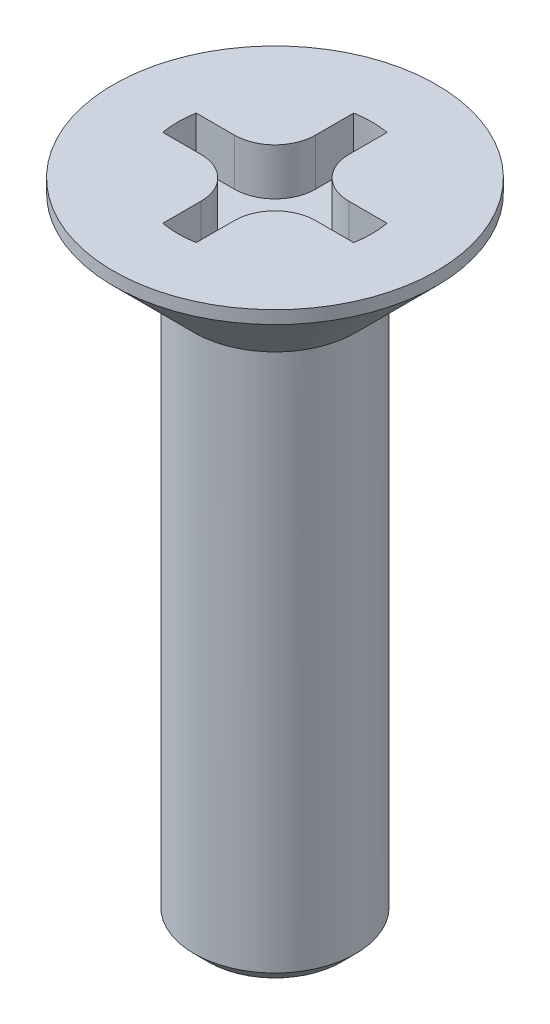
ISO-10303-21;
HEADER;
FILE_DESCRIPTION(('STEP AP214'),'2;1');
FILE_NAME('part.step','',(''),(''),'','','');
FILE_SCHEMA(('AUTOMOTIVE_DESIGN { 1 0 10303 214 1 1 1 1 }'));
ENDSEC;
DATA;
#1=APPLICATION_CONTEXT('core data for automotive mechanical design processes');
#2=APPLICATION_PROTOCOL_DEFINITION('international standard','automotive_design',2000,#1);
#3=PRODUCT_CONTEXT('',#1,'mechanical');
#4=PRODUCT('Part','Part','',(#3));
#5=PRODUCT_RELATED_PRODUCT_CATEGORY('part','',(#4));
#6=PRODUCT_DEFINITION_FORMATION('','',#4);
#7=PRODUCT_DEFINITION_CONTEXT('part definition',#1,'design');
#8=PRODUCT_DEFINITION('design','',#6,#7);
#9=PRODUCT_DEFINITION_SHAPE('','',#8);
#10=(LENGTH_UNIT() NAMED_UNIT(*) SI_UNIT(.MILLI.,.METRE.));
#11=(NAMED_UNIT(*) PLANE_ANGLE_UNIT() SI_UNIT($,.RADIAN.));
#12=(NAMED_UNIT(*) SI_UNIT($,.STERADIAN.) SOLID_ANGLE_UNIT());
#13=UNCERTAINTY_MEASURE_WITH_UNIT(LENGTH_MEASURE(1.E-05),#10,'distance_accuracy_value','');
#14=(GEOMETRIC_REPRESENTATION_CONTEXT(3) GLOBAL_UNCERTAINTY_ASSIGNED_CONTEXT((#13)) GLOBAL_UNIT_ASSIGNED_CONTEXT((#10,
#11,#12)) REPRESENTATION_CONTEXT('',''));
#15=CARTESIAN_POINT('',(0.,0.,0.));
#16=DIRECTION('',(0.,0.,1.));
#17=DIRECTION('',(1.,0.,0.));
#18=AXIS2_PLACEMENT_3D('',#15,#16,#17);
#19=CARTESIAN_POINT('',(0.,-8.55,0.));
#20=DIRECTION('',(0.,1.,0.));
#21=DIRECTION('',(-1.,0.,0.));
#22=AXIS2_PLACEMENT_3D('',#19,#20,#21);
#23=CYLINDRICAL_SURFACE('',#22,1.025);
#24=CARTESIAN_POINT('',(0.,0.,0.));
#25=DIRECTION('',(0.,1.,0.));
#26=DIRECTION('',(0.,0.,1.));
#27=AXIS2_PLACEMENT_3D('',#24,#25,#26);
#28=CIRCLE('',#27,1.025);
#29=CARTESIAN_POINT('',(0.,0.,1.025));
#30=VERTEX_POINT('',#29);
#31=EDGE_CURVE('P0_E21',#30,#30,#28,.F.);
#32=ORIENTED_EDGE('',*,*,#31,.T.);
#33=EDGE_LOOP('',(#32));
#34=FACE_BOUND('',#33,.T.);
#35=CARTESIAN_POINT('',(0.,-8.55,0.));
#36=DIRECTION('',(0.,1.,0.));
#37=DIRECTION('',(0.,0.,1.));
#38=AXIS2_PLACEMENT_3D('',#35,#36,#37);
#39=CIRCLE('',#38,1.025);
#40=CARTESIAN_POINT('',(0.,-8.55,1.025));
#41=VERTEX_POINT('',#40);
#42=EDGE_CURVE('P0_E11',#41,#41,#39,.T.);
#43=ORIENTED_EDGE('',*,*,#42,.T.);
#44=EDGE_LOOP('',(#43));
#45=FACE_BOUND('',#44,.T.);
#46=ADVANCED_FACE('P0_F17',(#34,#45),#23,.T.);
#47=CARTESIAN_POINT('',(0.,0.,0.));
#48=DIRECTION('',(0.,1.,0.));
#49=DIRECTION('',(1.,0.,0.));
#50=AXIS2_PLACEMENT_3D('',#47,#48,#49);
#51=PLANE('',#50);
#52=CARTESIAN_POINT('',(-1.25,0.,0.));
#53=CARTESIAN_POINT('',(-1.25,0.,0.248354274519565));
#54=CARTESIAN_POINT('',(-1.15484941563911,0.,0.478354290456362));
#55=CARTESIAN_POINT('',(-1.06001017605389,0.,0.707601717180522));
#56=CARTESIAN_POINT('',(-0.883883476483185,0.,0.883883476483185));
#57=CARTESIAN_POINT('',(-0.708534252031886,0.,1.05938707618712));
#58=CARTESIAN_POINT('',(-0.478354290456362,0.,1.15484941563911));
#59=CARTESIAN_POINT('',(-0.24919041101688,0.,1.24989035621207));
#60=CARTESIAN_POINT('',(0.,0.,1.25));
#61=CARTESIAN_POINT('',(0.248090411158747,0.,1.25010915978796));
#62=CARTESIAN_POINT('',(0.478354290456362,0.,1.15484941563911));
#63=CARTESIAN_POINT('',(0.707601717180586,0.,1.06001017605387));
#64=CARTESIAN_POINT('',(0.883883476483184,0.,0.883883476483185));
#65=CARTESIAN_POINT('',(1.05938707618716,0.,0.708534252031802));
#66=CARTESIAN_POINT('',(1.15484941563911,0.,0.478354290456362));
#67=CARTESIAN_POINT('',(1.25,0.,0.248926036573121));
#68=CARTESIAN_POINT('',(1.25,0.,0.));
#69=B_SPLINE_CURVE_WITH_KNOTS('',2,(#52,#53,#54,#55,#56,#57,#58,#59,#60,#61,#62,#63,#64,#65,#66,
#67,#68),.UNSPECIFIED.,.F.,.F.,(3,2,2,2,2,2,2,2,3),(0.,0.125,0.25,0.375,0.5,0.625,0.75,0.875,
1.),.UNSPECIFIED.);
#70=CARTESIAN_POINT('',(-1.25,0.,0.));
#71=VERTEX_POINT('',#70);
#72=CARTESIAN_POINT('',(1.25,0.,0.));
#73=VERTEX_POINT('',#72);
#74=EDGE_CURVE('P0_E35',#71,#73,#69,.T.);
#75=ORIENTED_EDGE('',*,*,#74,.F.);
#76=CARTESIAN_POINT('',(1.25,0.,0.));
#77=CARTESIAN_POINT('',(1.25,0.,-0.248354274519565));
#78=CARTESIAN_POINT('',(1.15484941563911,0.,-0.478354290456362));
#79=CARTESIAN_POINT('',(1.06001017605389,0.,-0.707601717180522));
#80=CARTESIAN_POINT('',(0.883883476483185,0.,-0.883883476483185));
#81=CARTESIAN_POINT('',(0.708534252031886,0.,-1.05938707618712));
#82=CARTESIAN_POINT('',(0.478354290456362,0.,-1.15484941563911));
#83=CARTESIAN_POINT('',(0.24919041101688,0.,-1.24989035621207));
#84=CARTESIAN_POINT('',(0.,0.,-1.25));
#85=CARTESIAN_POINT('',(-0.248090411158747,0.,-1.25010915978796));
#86=CARTESIAN_POINT('',(-0.478354290456362,0.,-1.15484941563911));
#87=CARTESIAN_POINT('',(-0.707601717180586,0.,-1.06001017605387));
#88=CARTESIAN_POINT('',(-0.883883476483184,0.,-0.883883476483185));
#89=CARTESIAN_POINT('',(-1.05938707618716,0.,-0.708534252031802));
#90=CARTESIAN_POINT('',(-1.15484941563911,0.,-0.478354290456362));
#91=CARTESIAN_POINT('',(-1.25,0.,-0.248926036573121));
#92=CARTESIAN_POINT('',(-1.25,0.,0.));
#93=B_SPLINE_CURVE_WITH_KNOTS('',2,(#76,#77,#78,#79,#80,#81,#82,#83,#84,#85,#86,#87,#88,#89,#90,
#91,#92),.UNSPECIFIED.,.F.,.F.,(3,2,2,2,2,2,2,2,3),(0.,0.125,0.25,0.375,0.5,0.625,0.75,0.875,
1.),.UNSPECIFIED.);
#94=EDGE_CURVE('P0_E33',#73,#71,#93,.T.);
#95=ORIENTED_EDGE('',*,*,#94,.F.);
#96=EDGE_LOOP('',(#75,#95));
#97=FACE_BOUND('',#96,.T.);
#98=ORIENTED_EDGE('',*,*,#31,.F.);
#99=EDGE_LOOP('',(#98));
#100=FACE_BOUND('',#99,.T.);
#101=ADVANCED_FACE('P0_F18',(#97,#100),#51,.F.);
#102=OPEN_SHELL('',(#46,#101));
#103=SHELL_BASED_SURFACE_MODEL('P0_B1',(#102));
#104=CARTESIAN_POINT('',(0.,0.725,0.));
#105=DIRECTION('',(0.,-1.,0.));
#106=DIRECTION('',(0.,0.,-1.));
#107=AXIS2_PLACEMENT_3D('',#104,#105,#106);
#108=PLANE('',#107);
#109=CARTESIAN_POINT('',(-0.8838834764832,0.725,0.8838834764832));
#110=DIRECTION('',(0.,1.,0.));
#111=DIRECTION('',(1.,0.,0.));
#112=AXIS2_PLACEMENT_3D('',#109,#110,#111);
#113=CIRCLE('',#112,0.625);
#114=CARTESIAN_POINT('',(-0.2588834764832,0.725,0.8838834764832));
#115=VERTEX_POINT('',#114);
#116=CARTESIAN_POINT('',(-0.8838834764832,0.725,0.2588834764832));
#117=VERTEX_POINT('',#116);
#118=EDGE_CURVE('P1_E11',#115,#117,#113,.T.);
#119=ORIENTED_EDGE('',*,*,#118,.F.);
#120=DIRECTION('',(0.,0.,-1.));
#121=VECTOR('',#120,1.);
#122=CARTESIAN_POINT('',(-0.2588834764832,0.725,1.477490895269));
#123=LINE('',#122,#121);
#124=CARTESIAN_POINT('',(-0.2588834764832,0.725,1.477490895269));
#125=VERTEX_POINT('',#124);
#126=EDGE_CURVE('P1_E316',#125,#115,#123,.T.);
#127=ORIENTED_EDGE('',*,*,#126,.F.);
#128=CARTESIAN_POINT('',(0.,0.725,0.));
#129=DIRECTION('',(0.,-1.,0.));
#130=DIRECTION('',(0.172588984322101,0.,0.984993930179606));
#131=AXIS2_PLACEMENT_3D('',#128,#129,#130);
#132=CIRCLE('',#131,1.5);
#133=CARTESIAN_POINT('',(0.2588834764832,0.725,1.477490895269));
#134=VERTEX_POINT('',#133);
#135=EDGE_CURVE('P1_E272',#134,#125,#132,.T.);
#136=ORIENTED_EDGE('',*,*,#135,.F.);
#137=DIRECTION('',(0.,0.,1.));
#138=VECTOR('',#137,1.);
#139=CARTESIAN_POINT('',(0.2588834764832,0.725,0.8838834764832));
#140=LINE('',#139,#138);
#141=CARTESIAN_POINT('',(0.2588834764832,0.725,0.8838834764832));
#142=VERTEX_POINT('',#141);
#143=EDGE_CURVE('P1_E74',#142,#134,#140,.T.);
#144=ORIENTED_EDGE('',*,*,#143,.F.);
#145=CARTESIAN_POINT('',(0.8838834764832,0.725,0.8838834764832));
#146=DIRECTION('',(0.,1.,0.));
#147=DIRECTION('',(0.,0.,-1.));
#148=AXIS2_PLACEMENT_3D('',#145,#146,#147);
#149=CIRCLE('',#148,0.625);
#150=CARTESIAN_POINT('',(0.8838834764832,0.725,0.2588834764832));
#151=VERTEX_POINT('',#150);
#152=EDGE_CURVE('P1_E83',#151,#142,#149,.T.);
#153=ORIENTED_EDGE('',*,*,#152,.F.);
#154=DIRECTION('',(-1.,0.,0.));
#155=VECTOR('',#154,1.);
#156=CARTESIAN_POINT('',(1.477490895269,0.725,0.2588834764832));
#157=LINE('',#156,#155);
#158=CARTESIAN_POINT('',(1.477490895269,0.725,0.2588834764832));
#159=VERTEX_POINT('',#158);
#160=EDGE_CURVE('P1_E202',#159,#151,#157,.T.);
#161=ORIENTED_EDGE('',*,*,#160,.F.);
#162=CARTESIAN_POINT('',(0.,0.725,0.));
#163=DIRECTION('',(0.,-1.,0.));
#164=DIRECTION('',(0.984993930179606,0.,-0.172588984322101));
#165=AXIS2_PLACEMENT_3D('',#162,#163,#164);
#166=CIRCLE('',#165,1.5);
#167=CARTESIAN_POINT('',(1.477490895269,0.725,-0.2588834764832));
#168=VERTEX_POINT('',#167);
#169=EDGE_CURVE('P1_E302',#168,#159,#166,.T.);
#170=ORIENTED_EDGE('',*,*,#169,.F.);
#171=DIRECTION('',(1.,0.,0.));
#172=VECTOR('',#171,1.);
#173=CARTESIAN_POINT('',(0.8838834764832,0.725,-0.2588834764832));
#174=LINE('',#173,#172);
#175=CARTESIAN_POINT('',(0.8838834764832,0.725,-0.2588834764832));
#176=VERTEX_POINT('',#175);
#177=EDGE_CURVE('P1_E292',#176,#168,#174,.T.);
#178=ORIENTED_EDGE('',*,*,#177,.F.);
#179=CARTESIAN_POINT('',(0.8838834764832,0.725,-0.8838834764832));
#180=DIRECTION('',(0.,1.,0.));
#181=DIRECTION('',(-1.,0.,0.));
#182=AXIS2_PLACEMENT_3D('',#179,#180,#181);
#183=CIRCLE('',#182,0.625);
#184=CARTESIAN_POINT('',(0.2588834764832,0.725,-0.8838834764832));
#185=VERTEX_POINT('',#184);
#186=EDGE_CURVE('P1_E290',#185,#176,#183,.T.);
#187=ORIENTED_EDGE('',*,*,#186,.F.);
#188=DIRECTION('',(0.,0.,1.));
#189=VECTOR('',#188,1.);
#190=CARTESIAN_POINT('',(0.2588834764832,0.725,-1.477490895269));
#191=LINE('',#190,#189);
#192=CARTESIAN_POINT('',(0.2588834764832,0.725,-1.477490895269));
#193=VERTEX_POINT('',#192);
#194=EDGE_CURVE('P1_E263',#193,#185,#191,.T.);
#195=ORIENTED_EDGE('',*,*,#194,.F.);
#196=CARTESIAN_POINT('',(0.,0.725,0.));
#197=DIRECTION('',(0.,-1.,0.));
#198=DIRECTION('',(-0.172588984322101,0.,-0.984993930179606));
#199=AXIS2_PLACEMENT_3D('',#196,#197,#198);
#200=CIRCLE('',#199,1.5);
#201=CARTESIAN_POINT('',(-0.2588834764832,0.725,-1.477490895269));
#202=VERTEX_POINT('',#201);
#203=EDGE_CURVE('P1_E252',#202,#193,#200,.T.);
#204=ORIENTED_EDGE('',*,*,#203,.F.);
#205=DIRECTION('',(0.,0.,-1.));
#206=VECTOR('',#205,1.);
#207=CARTESIAN_POINT('',(-0.2588834764832,0.725,-0.8838834764832));
#208=LINE('',#207,#206);
#209=CARTESIAN_POINT('',(-0.2588834764832,0.725,-0.8838834764832));
#210=VERTEX_POINT('',#209);
#211=EDGE_CURVE('P1_E167',#210,#202,#208,.T.);
#212=ORIENTED_EDGE('',*,*,#211,.F.);
#213=CARTESIAN_POINT('',(-0.8838834764832,0.725,-0.8838834764832));
#214=DIRECTION('',(0.,1.,0.));
#215=DIRECTION('',(0.,0.,1.));
#216=AXIS2_PLACEMENT_3D('',#213,#214,#215);
#217=CIRCLE('',#216,0.625);
#218=CARTESIAN_POINT('',(-0.8838834764832,0.725,-0.2588834764832));
#219=VERTEX_POINT('',#218);
#220=EDGE_CURVE('P1_E162',#219,#210,#217,.T.);
#221=ORIENTED_EDGE('',*,*,#220,.F.);
#222=DIRECTION('',(1.,0.,0.));
#223=VECTOR('',#222,1.);
#224=CARTESIAN_POINT('',(-1.477490895269,0.725,-0.2588834764832));
#225=LINE('',#224,#223);
#226=CARTESIAN_POINT('',(-1.477490895269,0.725,-0.2588834764832));
#227=VERTEX_POINT('',#226);
#228=EDGE_CURVE('P1_E157',#227,#219,#225,.T.);
#229=ORIENTED_EDGE('',*,*,#228,.F.);
#230=CARTESIAN_POINT('',(0.,0.725,0.));
#231=DIRECTION('',(0.,-1.,0.));
#232=DIRECTION('',(-0.984993930179606,0.,0.172588984322101));
#233=AXIS2_PLACEMENT_3D('',#230,#231,#232);
#234=CIRCLE('',#233,1.5);
#235=CARTESIAN_POINT('',(-1.477490895269,0.725,0.2588834764832));
#236=VERTEX_POINT('',#235);
#237=EDGE_CURVE('P1_E195',#236,#227,#234,.T.);
#238=ORIENTED_EDGE('',*,*,#237,.F.);
#239=DIRECTION('',(-1.,0.,0.));
#240=VECTOR('',#239,1.);
#241=CARTESIAN_POINT('',(-0.8838834764832,0.725,0.2588834764832));
#242=LINE('',#241,#240);
#243=EDGE_CURVE('P1_E250',#117,#236,#242,.T.);
#244=ORIENTED_EDGE('',*,*,#243,.F.);
#245=EDGE_LOOP('',(#119,#127,#136,#144,#153,#161,#170,#178,#187,#195,#204,#212,#221,#229,#238,#244));
#246=FACE_BOUND('',#245,.T.);
#247=ADVANCED_FACE('P1_F17',(#246),#108,.F.);
#248=CARTESIAN_POINT('',(-0.8838834764832,0.725,0.8838834764832));
#249=DIRECTION('',(0.,-1.,0.));
#250=DIRECTION('',(1.,0.,0.));
#251=AXIS2_PLACEMENT_3D('',#248,#249,#250);
#252=CYLINDRICAL_SURFACE('',#251,0.625);
#253=DIRECTION('',(0.,1.,0.));
#254=VECTOR('',#253,1.);
#255=CARTESIAN_POINT('',(-0.2588834764832,0.725,0.8838834764832));
#256=LINE('',#255,#254);
#257=CARTESIAN_POINT('',(-0.2588834764832,1.45,0.8838834764832));
#258=VERTEX_POINT('',#257);
#259=EDGE_CURVE('P1_E27',#115,#258,#256,.T.);
#260=ORIENTED_EDGE('',*,*,#259,.F.);
#261=ORIENTED_EDGE('',*,*,#118,.T.);
#262=DIRECTION('',(0.,1.,0.));
#263=VECTOR('',#262,1.);
#264=CARTESIAN_POINT('',(-0.8838834764832,0.725,0.2588834764832));
#265=LINE('',#264,#263);
#266=CARTESIAN_POINT('',(-0.8838834764832,1.45,0.2588834764832));
#267=VERTEX_POINT('',#266);
#268=EDGE_CURVE('P1_E243',#117,#267,#265,.T.);
#269=ORIENTED_EDGE('',*,*,#268,.T.);
#270=CARTESIAN_POINT('',(-0.8838834764832,1.45,0.8838834764832));
#271=DIRECTION('',(0.,1.,0.));
#272=DIRECTION('',(1.,0.,0.));
#273=AXIS2_PLACEMENT_3D('',#270,#271,#272);
#274=CIRCLE('',#273,0.625);
#275=EDGE_CURVE('P1_E242',#258,#267,#274,.T.);
#276=ORIENTED_EDGE('',*,*,#275,.F.);
#277=EDGE_LOOP('',(#260,#261,#269,#276));
#278=FACE_BOUND('',#277,.T.);
#279=ADVANCED_FACE('P1_F330',(#278),#252,.T.);
#280=CARTESIAN_POINT('',(-0.2588834764832,0.725,1.477490895269));
#281=DIRECTION('',(-1.,0.,0.));
#282=DIRECTION('',(0.,0.,1.));
#283=AXIS2_PLACEMENT_3D('',#280,#281,#282);
#284=PLANE('',#283);
#285=DIRECTION('',(0.,1.,0.));
#286=VECTOR('',#285,1.);
#287=CARTESIAN_POINT('',(-0.2588834764832,0.725,1.477490895269));
#288=LINE('',#287,#286);
#289=CARTESIAN_POINT('',(-0.2588834764832,1.45,1.477490895269));
#290=VERTEX_POINT('',#289);
#291=EDGE_CURVE('P1_E277',#125,#290,#288,.T.);
#292=ORIENTED_EDGE('',*,*,#291,.F.);
#293=ORIENTED_EDGE('',*,*,#126,.T.);
#294=ORIENTED_EDGE('',*,*,#259,.T.);
#295=DIRECTION('',(0.,0.,-1.));
#296=VECTOR('',#295,1.);
#297=CARTESIAN_POINT('',(-0.2588834764832,1.45,1.477490895269));
#298=LINE('',#297,#296);
#299=EDGE_CURVE('P1_E237',#290,#258,#298,.T.);
#300=ORIENTED_EDGE('',*,*,#299,.F.);
#301=EDGE_LOOP('',(#292,#293,#294,#300));
#302=FACE_BOUND('',#301,.T.);
#303=ADVANCED_FACE('P1_F324',(#302),#284,.F.);
#304=CARTESIAN_POINT('',(0.,0.725,0.));
#305=DIRECTION('',(0.,-1.,0.));
#306=DIRECTION('',(1.,0.,0.));
#307=AXIS2_PLACEMENT_3D('',#304,#305,#306);
#308=CYLINDRICAL_SURFACE('',#307,1.5);
#309=DIRECTION('',(0.,1.,0.));
#310=VECTOR('',#309,1.);
#311=CARTESIAN_POINT('',(0.2588834764832,0.725,1.477490895269));
#312=LINE('',#311,#310);
#313=CARTESIAN_POINT('',(0.2588834764832,1.45,1.477490895269));
#314=VERTEX_POINT('',#313);
#315=EDGE_CURVE('P1_E280',#134,#314,#312,.T.);
#316=ORIENTED_EDGE('',*,*,#315,.F.);
#317=ORIENTED_EDGE('',*,*,#135,.T.);
#318=ORIENTED_EDGE('',*,*,#291,.T.);
#319=CARTESIAN_POINT('',(0.,1.45,0.));
#320=DIRECTION('',(0.,-1.,0.));
#321=DIRECTION('',(0.172588984322101,0.,0.984993930179606));
#322=AXIS2_PLACEMENT_3D('',#319,#320,#321);
#323=CIRCLE('',#322,1.5);
#324=EDGE_CURVE('P1_E234',#314,#290,#323,.T.);
#325=ORIENTED_EDGE('',*,*,#324,.F.);
#326=EDGE_LOOP('',(#316,#317,#318,#325));
#327=FACE_BOUND('',#326,.T.);
#328=ADVANCED_FACE('P1_F339',(#327),#308,.F.);
#329=CARTESIAN_POINT('',(0.2588834764832,0.725,0.8838834764832));
#330=DIRECTION('',(1.,0.,0.));
#331=DIRECTION('',(0.,1.,0.));
#332=AXIS2_PLACEMENT_3D('',#329,#330,#331);
#333=PLANE('',#332);
#334=DIRECTION('',(0.,1.,0.));
#335=VECTOR('',#334,1.);
#336=CARTESIAN_POINT('',(0.2588834764832,0.725,0.8838834764832));
#337=LINE('',#336,#335);
#338=CARTESIAN_POINT('',(0.2588834764832,1.45,0.8838834764832));
#339=VERTEX_POINT('',#338);
#340=EDGE_CURVE('P1_E310',#142,#339,#337,.T.);
#341=ORIENTED_EDGE('',*,*,#340,.F.);
#342=ORIENTED_EDGE('',*,*,#143,.T.);
#343=ORIENTED_EDGE('',*,*,#315,.T.);
#344=DIRECTION('',(0.,0.,1.));
#345=VECTOR('',#344,1.);
#346=CARTESIAN_POINT('',(0.2588834764832,1.45,0.8838834764832));
#347=LINE('',#346,#345);
#348=EDGE_CURVE('P1_E231',#339,#314,#347,.T.);
#349=ORIENTED_EDGE('',*,*,#348,.F.);
#350=EDGE_LOOP('',(#341,#342,#343,#349));
#351=FACE_BOUND('',#350,.T.);
#352=ADVANCED_FACE('P1_F340',(#351),#333,.F.);
#353=CARTESIAN_POINT('',(0.8838834764832,0.725,0.8838834764832));
#354=DIRECTION('',(0.,-1.,0.));
#355=DIRECTION('',(1.,0.,0.));
#356=AXIS2_PLACEMENT_3D('',#353,#354,#355);
#357=CYLINDRICAL_SURFACE('',#356,0.625);
#358=DIRECTION('',(0.,1.,0.));
#359=VECTOR('',#358,1.);
#360=CARTESIAN_POINT('',(0.8838834764832,0.725,0.2588834764832));
#361=LINE('',#360,#359);
#362=CARTESIAN_POINT('',(0.8838834764832,1.45,0.2588834764832));
#363=VERTEX_POINT('',#362);
#364=EDGE_CURVE('P1_E207',#151,#363,#361,.T.);
#365=ORIENTED_EDGE('',*,*,#364,.F.);
#366=ORIENTED_EDGE('',*,*,#152,.T.);
#367=ORIENTED_EDGE('',*,*,#340,.T.);
#368=CARTESIAN_POINT('',(0.8838834764832,1.45,0.8838834764832));
#369=DIRECTION('',(0.,1.,0.));
#370=DIRECTION('',(0.,0.,-1.));
#371=AXIS2_PLACEMENT_3D('',#368,#369,#370);
#372=CIRCLE('',#371,0.625);
#373=EDGE_CURVE('P1_E227',#363,#339,#372,.T.);
#374=ORIENTED_EDGE('',*,*,#373,.F.);
#375=EDGE_LOOP('',(#365,#366,#367,#374));
#376=FACE_BOUND('',#375,.T.);
#377=ADVANCED_FACE('P1_F447',(#376),#357,.T.);
#378=CARTESIAN_POINT('',(1.477490895269,0.725,0.2588834764832));
#379=DIRECTION('',(0.,0.,1.));
#380=DIRECTION('',(1.,0.,0.));
#381=AXIS2_PLACEMENT_3D('',#378,#379,#380);
#382=PLANE('',#381);
#383=DIRECTION('',(0.,1.,0.));
#384=VECTOR('',#383,1.);
#385=CARTESIAN_POINT('',(1.477490895269,0.725,0.2588834764832));
#386=LINE('',#385,#384);
#387=CARTESIAN_POINT('',(1.477490895269,1.45,0.2588834764832));
#388=VERTEX_POINT('',#387);
#389=EDGE_CURVE('P1_E209',#159,#388,#386,.T.);
#390=ORIENTED_EDGE('',*,*,#389,.F.);
#391=ORIENTED_EDGE('',*,*,#160,.T.);
#392=ORIENTED_EDGE('',*,*,#364,.T.);
#393=DIRECTION('',(-1.,0.,0.));
#394=VECTOR('',#393,1.);
#395=CARTESIAN_POINT('',(1.477490895269,1.45,0.2588834764832));
#396=LINE('',#395,#394);
#397=EDGE_CURVE('P1_E226',#388,#363,#396,.T.);
#398=ORIENTED_EDGE('',*,*,#397,.F.);
#399=EDGE_LOOP('',(#390,#391,#392,#398));
#400=FACE_BOUND('',#399,.T.);
#401=ADVANCED_FACE('P1_F395',(#400),#382,.F.);
#402=CARTESIAN_POINT('',(0.,0.725,0.));
#403=DIRECTION('',(0.,-1.,0.));
#404=DIRECTION('',(1.,0.,0.));
#405=AXIS2_PLACEMENT_3D('',#402,#403,#404);
#406=CYLINDRICAL_SURFACE('',#405,1.5);
#407=DIRECTION('',(0.,1.,0.));
#408=VECTOR('',#407,1.);
#409=CARTESIAN_POINT('',(1.477490895269,0.725,-0.2588834764832));
#410=LINE('',#409,#408);
#411=CARTESIAN_POINT('',(1.477490895269,1.45,-0.2588834764832));
#412=VERTEX_POINT('',#411);
#413=EDGE_CURVE('P1_E297',#168,#412,#410,.T.);
#414=ORIENTED_EDGE('',*,*,#413,.F.);
#415=ORIENTED_EDGE('',*,*,#169,.T.);
#416=ORIENTED_EDGE('',*,*,#389,.T.);
#417=CARTESIAN_POINT('',(0.,1.45,0.));
#418=DIRECTION('',(0.,-1.,0.));
#419=DIRECTION('',(0.984993930179606,0.,-0.172588984322101));
#420=AXIS2_PLACEMENT_3D('',#417,#418,#419);
#421=CIRCLE('',#420,1.5);
#422=EDGE_CURVE('P1_E225',#412,#388,#421,.T.);
#423=ORIENTED_EDGE('',*,*,#422,.F.);
#424=EDGE_LOOP('',(#414,#415,#416,#423));
#425=FACE_BOUND('',#424,.T.);
#426=ADVANCED_FACE('P1_F388',(#425),#406,.F.);
#427=CARTESIAN_POINT('',(0.8838834764832,0.725,-0.2588834764832));
#428=DIRECTION('',(0.,0.,-1.));
#429=DIRECTION('',(0.,-1.,0.));
#430=AXIS2_PLACEMENT_3D('',#427,#428,#429);
#431=PLANE('',#430);
#432=ORIENTED_EDGE('',*,*,#177,.T.);
#433=ORIENTED_EDGE('',*,*,#413,.T.);
#434=DIRECTION('',(1.,0.,0.));
#435=VECTOR('',#434,1.);
#436=CARTESIAN_POINT('',(0.8838834764832,1.45,-0.2588834764832));
#437=LINE('',#436,#435);
#438=CARTESIAN_POINT('',(0.8838834764832,1.45,-0.2588834764832));
#439=VERTEX_POINT('',#438);
#440=EDGE_CURVE('P1_E217',#439,#412,#437,.T.);
#441=ORIENTED_EDGE('',*,*,#440,.F.);
#442=DIRECTION('',(0.,1.,0.));
#443=VECTOR('',#442,1.);
#444=CARTESIAN_POINT('',(0.8838834764832,0.725,-0.2588834764832));
#445=LINE('',#444,#443);
#446=EDGE_CURVE('P1_E295',#176,#439,#445,.T.);
#447=ORIENTED_EDGE('',*,*,#446,.F.);
#448=EDGE_LOOP('',(#432,#433,#441,#447));
#449=FACE_BOUND('',#448,.T.);
#450=ADVANCED_FACE('P1_F384',(#449),#431,.F.);
#451=CARTESIAN_POINT('',(0.8838834764832,0.725,-0.8838834764832));
#452=DIRECTION('',(0.,-1.,0.));
#453=DIRECTION('',(1.,0.,0.));
#454=AXIS2_PLACEMENT_3D('',#451,#452,#453);
#455=CYLINDRICAL_SURFACE('',#454,0.625);
#456=ORIENTED_EDGE('',*,*,#186,.T.);
#457=ORIENTED_EDGE('',*,*,#446,.T.);
#458=CARTESIAN_POINT('',(0.8838834764832,1.45,-0.8838834764832));
#459=DIRECTION('',(0.,-1.,0.));
#460=DIRECTION('',(0.,0.,1.));
#461=AXIS2_PLACEMENT_3D('',#458,#459,#460);
#462=CIRCLE('',#461,0.625);
#463=CARTESIAN_POINT('',(0.2588834764832,1.45,-0.8838834764832));
#464=VERTEX_POINT('',#463);
#465=EDGE_CURVE('P1_E212',#439,#464,#462,.T.);
#466=ORIENTED_EDGE('',*,*,#465,.T.);
#467=DIRECTION('',(0.,1.,0.));
#468=VECTOR('',#467,1.);
#469=CARTESIAN_POINT('',(0.2588834764832,0.725,-0.8838834764832));
#470=LINE('',#469,#468);
#471=EDGE_CURVE('P1_E286',#185,#464,#470,.T.);
#472=ORIENTED_EDGE('',*,*,#471,.F.);
#473=EDGE_LOOP('',(#456,#457,#466,#472));
#474=FACE_BOUND('',#473,.T.);
#475=ADVANCED_FACE('P1_F374',(#474),#455,.T.);
#476=CARTESIAN_POINT('',(0.2588834764832,0.725,-1.477490895269));
#477=DIRECTION('',(1.,0.,0.));
#478=DIRECTION('',(0.,1.,0.));
#479=AXIS2_PLACEMENT_3D('',#476,#477,#478);
#480=PLANE('',#479);
#481=ORIENTED_EDGE('',*,*,#194,.T.);
#482=ORIENTED_EDGE('',*,*,#471,.T.);
#483=DIRECTION('',(0.,0.,1.));
#484=VECTOR('',#483,1.);
#485=CARTESIAN_POINT('',(0.2588834764832,1.45,-1.477490895269));
#486=LINE('',#485,#484);
#487=CARTESIAN_POINT('',(0.2588834764832,1.45,-1.477490895269));
#488=VERTEX_POINT('',#487);
#489=EDGE_CURVE('P1_E204',#488,#464,#486,.T.);
#490=ORIENTED_EDGE('',*,*,#489,.F.);
#491=DIRECTION('',(0.,1.,0.));
#492=VECTOR('',#491,1.);
#493=CARTESIAN_POINT('',(0.2588834764832,0.725,-1.477490895269));
#494=LINE('',#493,#492);
#495=EDGE_CURVE('P1_E258',#193,#488,#494,.T.);
#496=ORIENTED_EDGE('',*,*,#495,.F.);
#497=EDGE_LOOP('',(#481,#482,#490,#496));
#498=FACE_BOUND('',#497,.T.);
#499=ADVANCED_FACE('P1_F369',(#498),#480,.F.);
#500=CARTESIAN_POINT('',(0.,0.725,0.));
#501=DIRECTION('',(0.,-1.,0.));
#502=DIRECTION('',(1.,0.,0.));
#503=AXIS2_PLACEMENT_3D('',#500,#501,#502);
#504=CYLINDRICAL_SURFACE('',#503,1.5);
#505=ORIENTED_EDGE('',*,*,#203,.T.);
#506=ORIENTED_EDGE('',*,*,#495,.T.);
#507=CARTESIAN_POINT('',(0.,1.45,0.));
#508=DIRECTION('',(0.,-1.,0.));
#509=DIRECTION('',(-0.172588984322101,0.,-0.984993930179606));
#510=AXIS2_PLACEMENT_3D('',#507,#508,#509);
#511=CIRCLE('',#510,1.5);
#512=CARTESIAN_POINT('',(-0.2588834764832,1.45,-1.477490895269));
#513=VERTEX_POINT('',#512);
#514=EDGE_CURVE('P1_E199',#513,#488,#511,.T.);
#515=ORIENTED_EDGE('',*,*,#514,.F.);
#516=DIRECTION('',(0.,1.,0.));
#517=VECTOR('',#516,1.);
#518=CARTESIAN_POINT('',(-0.2588834764832,0.725,-1.477490895269));
#519=LINE('',#518,#517);
#520=EDGE_CURVE('P1_E260',#202,#513,#519,.T.);
#521=ORIENTED_EDGE('',*,*,#520,.F.);
#522=EDGE_LOOP('',(#505,#506,#515,#521));
#523=FACE_BOUND('',#522,.T.);
#524=ADVANCED_FACE('P1_F385',(#523),#504,.F.);
#525=CARTESIAN_POINT('',(-0.2588834764832,0.725,-0.8838834764832));
#526=DIRECTION('',(-1.,0.,0.));
#527=DIRECTION('',(0.,0.,1.));
#528=AXIS2_PLACEMENT_3D('',#525,#526,#527);
#529=PLANE('',#528);
#530=ORIENTED_EDGE('',*,*,#211,.T.);
#531=ORIENTED_EDGE('',*,*,#520,.T.);
#532=DIRECTION('',(0.,0.,-1.));
#533=VECTOR('',#532,1.);
#534=CARTESIAN_POINT('',(-0.2588834764832,1.45,-0.8838834764832));
#535=LINE('',#534,#533);
#536=CARTESIAN_POINT('',(-0.2588834764832,1.45,-0.8838834764832));
#537=VERTEX_POINT('',#536);
#538=EDGE_CURVE('P1_E197',#537,#513,#535,.T.);
#539=ORIENTED_EDGE('',*,*,#538,.F.);
#540=DIRECTION('',(0.,1.,0.));
#541=VECTOR('',#540,1.);
#542=CARTESIAN_POINT('',(-0.2588834764832,0.725,-0.8838834764832));
#543=LINE('',#542,#541);
#544=EDGE_CURVE('P1_E168',#210,#537,#543,.T.);
#545=ORIENTED_EDGE('',*,*,#544,.F.);
#546=EDGE_LOOP('',(#530,#531,#539,#545));
#547=FACE_BOUND('',#546,.T.);
#548=ADVANCED_FACE('P1_F461',(#547),#529,.F.);
#549=CARTESIAN_POINT('',(-0.8838834764832,0.725,-0.8838834764832));
#550=DIRECTION('',(0.,-1.,0.));
#551=DIRECTION('',(1.,0.,0.));
#552=AXIS2_PLACEMENT_3D('',#549,#550,#551);
#553=CYLINDRICAL_SURFACE('',#552,0.625);
#554=ORIENTED_EDGE('',*,*,#220,.T.);
#555=ORIENTED_EDGE('',*,*,#544,.T.);
#556=CARTESIAN_POINT('',(-0.8838834764832,1.45,-0.8838834764832));
#557=DIRECTION('',(0.,-1.,0.));
#558=DIRECTION('',(1.,0.,0.));
#559=AXIS2_PLACEMENT_3D('',#556,#557,#558);
#560=CIRCLE('',#559,0.625);
#561=CARTESIAN_POINT('',(-0.8838834764832,1.45,-0.2588834764832));
#562=VERTEX_POINT('',#561);
#563=EDGE_CURVE('P1_E176',#537,#562,#560,.T.);
#564=ORIENTED_EDGE('',*,*,#563,.T.);
#565=DIRECTION('',(0.,1.,0.));
#566=VECTOR('',#565,1.);
#567=CARTESIAN_POINT('',(-0.8838834764832,0.725,-0.2588834764832));
#568=LINE('',#567,#566);
#569=EDGE_CURVE('P1_E171',#219,#562,#568,.T.);
#570=ORIENTED_EDGE('',*,*,#569,.F.);
#571=EDGE_LOOP('',(#554,#555,#564,#570));
#572=FACE_BOUND('',#571,.T.);
#573=ADVANCED_FACE('P1_F173',(#572),#553,.T.);
#574=CARTESIAN_POINT('',(-1.477490895269,0.725,-0.2588834764832));
#575=DIRECTION('',(0.,0.,-1.));
#576=DIRECTION('',(0.,-1.,0.));
#577=AXIS2_PLACEMENT_3D('',#574,#575,#576);
#578=PLANE('',#577);
#579=ORIENTED_EDGE('',*,*,#228,.T.);
#580=ORIENTED_EDGE('',*,*,#569,.T.);
#581=DIRECTION('',(1.,0.,0.));
#582=VECTOR('',#581,1.);
#583=CARTESIAN_POINT('',(-1.477490895269,1.45,-0.2588834764832));
#584=LINE('',#583,#582);
#585=CARTESIAN_POINT('',(-1.477490895269,1.45,-0.2588834764832));
#586=VERTEX_POINT('',#585);
#587=EDGE_CURVE('P1_E351',#586,#562,#584,.T.);
#588=ORIENTED_EDGE('',*,*,#587,.F.);
#589=DIRECTION('',(0.,1.,0.));
#590=VECTOR('',#589,1.);
#591=CARTESIAN_POINT('',(-1.477490895269,0.725,-0.2588834764832));
#592=LINE('',#591,#590);
#593=EDGE_CURVE('P1_E182',#227,#586,#592,.T.);
#594=ORIENTED_EDGE('',*,*,#593,.F.);
#595=EDGE_LOOP('',(#579,#580,#588,#594));
#596=FACE_BOUND('',#595,.T.);
#597=ADVANCED_FACE('P1_F181',(#596),#578,.F.);
#598=CARTESIAN_POINT('',(0.,0.725,0.));
#599=DIRECTION('',(0.,-1.,0.));
#600=DIRECTION('',(1.,0.,0.));
#601=AXIS2_PLACEMENT_3D('',#598,#599,#600);
#602=CYLINDRICAL_SURFACE('',#601,1.5);
#603=DIRECTION('',(0.,1.,0.));
#604=VECTOR('',#603,1.);
#605=CARTESIAN_POINT('',(-1.477490895269,0.725,0.2588834764832));
#606=LINE('',#605,#604);
#607=CARTESIAN_POINT('',(-1.477490895269,1.45,0.2588834764832));
#608=VERTEX_POINT('',#607);
#609=EDGE_CURVE('P1_E270',#236,#608,#606,.T.);
#610=ORIENTED_EDGE('',*,*,#609,.F.);
#611=ORIENTED_EDGE('',*,*,#237,.T.);
#612=ORIENTED_EDGE('',*,*,#593,.T.);
#613=CARTESIAN_POINT('',(0.,1.45,0.));
#614=DIRECTION('',(0.,-1.,0.));
#615=DIRECTION('',(-0.984993930179606,0.,0.172588984322101));
#616=AXIS2_PLACEMENT_3D('',#613,#614,#615);
#617=CIRCLE('',#616,1.5);
#618=EDGE_CURVE('P1_E349',#608,#586,#617,.T.);
#619=ORIENTED_EDGE('',*,*,#618,.F.);
#620=EDGE_LOOP('',(#610,#611,#612,#619));
#621=FACE_BOUND('',#620,.T.);
#622=ADVANCED_FACE('P1_F466',(#621),#602,.F.);
#623=CARTESIAN_POINT('',(-0.8838834764832,0.725,0.2588834764832));
#624=DIRECTION('',(0.,0.,1.));
#625=DIRECTION('',(1.,0.,0.));
#626=AXIS2_PLACEMENT_3D('',#623,#624,#625);
#627=PLANE('',#626);
#628=ORIENTED_EDGE('',*,*,#268,.F.);
#629=ORIENTED_EDGE('',*,*,#243,.T.);
#630=ORIENTED_EDGE('',*,*,#609,.T.);
#631=DIRECTION('',(-1.,0.,0.));
#632=VECTOR('',#631,1.);
#633=CARTESIAN_POINT('',(-0.8838834764832,1.45,0.2588834764832));
#634=LINE('',#633,#632);
#635=EDGE_CURVE('P1_E249',#267,#608,#634,.T.);
#636=ORIENTED_EDGE('',*,*,#635,.F.);
#637=EDGE_LOOP('',(#628,#629,#630,#636));
#638=FACE_BOUND('',#637,.T.);
#639=ADVANCED_FACE('P1_F472',(#638),#627,.F.);
#640=CARTESIAN_POINT('',(0.,1.45,0.));
#641=DIRECTION('',(0.,-1.,0.));
#642=DIRECTION('',(0.,0.,-1.));
#643=AXIS2_PLACEMENT_3D('',#640,#641,#642);
#644=PLANE('',#643);
#645=ORIENTED_EDGE('',*,*,#618,.T.);
#646=ORIENTED_EDGE('',*,*,#587,.T.);
#647=ORIENTED_EDGE('',*,*,#563,.F.);
#648=ORIENTED_EDGE('',*,*,#538,.T.);
#649=ORIENTED_EDGE('',*,*,#514,.T.);
#650=ORIENTED_EDGE('',*,*,#489,.T.);
#651=ORIENTED_EDGE('',*,*,#465,.F.);
#652=ORIENTED_EDGE('',*,*,#440,.T.);
#653=ORIENTED_EDGE('',*,*,#422,.T.);
#654=ORIENTED_EDGE('',*,*,#397,.T.);
#655=ORIENTED_EDGE('',*,*,#373,.T.);
#656=ORIENTED_EDGE('',*,*,#348,.T.);
#657=ORIENTED_EDGE('',*,*,#324,.T.);
#658=ORIENTED_EDGE('',*,*,#299,.T.);
#659=ORIENTED_EDGE('',*,*,#275,.T.);
#660=ORIENTED_EDGE('',*,*,#635,.T.);
#661=EDGE_LOOP('',(#645,#646,#647,#648,#649,#650,#651,#652,#653,#654,#655,#656,#657,#658,#659,#660));
#662=FACE_BOUND('',#661,.T.);
#663=CARTESIAN_POINT('',(0.,1.45,0.));
#664=DIRECTION('',(0.,-1.,0.));
#665=DIRECTION('',(1.,0.,0.));
#666=AXIS2_PLACEMENT_3D('',#663,#664,#665);
#667=CIRCLE('',#666,2.5);
#668=CARTESIAN_POINT('',(2.5,1.45,0.));
#669=VERTEX_POINT('',#668);
#670=EDGE_CURVE('P1_E348',#669,#669,#667,.T.);
#671=ORIENTED_EDGE('',*,*,#670,.F.);
#672=EDGE_LOOP('',(#671));
#673=FACE_BOUND('',#672,.T.);
#674=ADVANCED_FACE('P1_F335',(#662,#673),#644,.F.);
#675=CARTESIAN_POINT('',(0.,1.95,0.));
#676=DIRECTION('',(0.,-1.,0.));
#677=DIRECTION('',(-1.,0.,0.));
#678=AXIS2_PLACEMENT_3D('',#675,#676,#677);
#679=CYLINDRICAL_SURFACE('',#678,2.5);
#680=ORIENTED_EDGE('',*,*,#670,.T.);
#681=EDGE_LOOP('',(#680));
#682=FACE_BOUND('',#681,.T.);
#683=CARTESIAN_POINT('',(0.,1.25,0.));
#684=DIRECTION('',(0.,1.,0.));
#685=DIRECTION('',(1.,0.,0.));
#686=AXIS2_PLACEMENT_3D('',#683,#684,#685);
#687=CIRCLE('',#686,2.5);
#688=CARTESIAN_POINT('',(2.5,1.25,0.));
#689=VERTEX_POINT('',#688);
#690=EDGE_CURVE('P1_E402',#689,#689,#687,.T.);
#691=ORIENTED_EDGE('',*,*,#690,.T.);
#692=EDGE_LOOP('',(#691));
#693=FACE_BOUND('',#692,.T.);
#694=ADVANCED_FACE('P1_F476',(#682,#693),#679,.T.);
#695=CARTESIAN_POINT('',(0.,0.625,0.));
#696=DIRECTION('',(0.,1.,0.));
#697=DIRECTION('',(1.,0.,0.));
#698=AXIS2_PLACEMENT_3D('',#695,#696,#697);
#699=CONICAL_SURFACE('',#698,1.875,0.7853981633973);
#700=ORIENTED_EDGE('',*,*,#690,.F.);
#701=EDGE_LOOP('',(#700));
#702=FACE_BOUND('',#701,.T.);
#703=CARTESIAN_POINT('',(0.,0.,0.));
#704=DIRECTION('',(0.,-1.,0.));
#705=DIRECTION('',(1.,0.,0.));
#706=AXIS2_PLACEMENT_3D('',#703,#704,#705);
#707=CIRCLE('',#706,1.25);
#708=CARTESIAN_POINT('',(1.25,0.,0.));
#709=VERTEX_POINT('',#708);
#710=EDGE_CURVE('P1_E405',#709,#709,#707,.T.);
#711=ORIENTED_EDGE('',*,*,#710,.F.);
#712=EDGE_LOOP('',(#711));
#713=FACE_BOUND('',#712,.T.);
#714=ADVANCED_FACE('P1_F474',(#702,#713),#699,.T.);
#715=CARTESIAN_POINT('',(0.,1.95,0.));
#716=DIRECTION('',(0.,-1.,0.));
#717=DIRECTION('',(-1.,0.,0.));
#718=AXIS2_PLACEMENT_3D('',#715,#716,#717);
#719=CYLINDRICAL_SURFACE('',#718,1.25);
#720=ORIENTED_EDGE('',*,*,#710,.T.);
#721=EDGE_LOOP('',(#720));
#722=FACE_BOUND('',#721,.T.);
#723=CARTESIAN_POINT('',(0.,-8.325,0.));
#724=DIRECTION('',(0.,-1.,0.));
#725=DIRECTION('',(-1.,0.,0.));
#726=AXIS2_PLACEMENT_3D('',#723,#724,#725);
#727=CIRCLE('',#726,1.25);
#728=CARTESIAN_POINT('',(-1.25,-8.325,0.));
#729=VERTEX_POINT('',#728);
#730=EDGE_CURVE('P1_E404',#729,#729,#727,.T.);
#731=ORIENTED_EDGE('',*,*,#730,.F.);
#732=EDGE_LOOP('',(#731));
#733=FACE_BOUND('',#732,.T.);
#734=ADVANCED_FACE('P1_F435',(#722,#733),#719,.T.);
#735=CARTESIAN_POINT('',(0.,-8.4375,0.));
#736=DIRECTION('',(0.,1.,0.));
#737=DIRECTION('',(1.,0.,0.));
#738=AXIS2_PLACEMENT_3D('',#735,#736,#737);
#739=CONICAL_SURFACE('',#738,1.1375,0.7853981633973);
#740=CARTESIAN_POINT('',(0.,-8.55,0.));
#741=DIRECTION('',(0.,1.,0.));
#742=DIRECTION('',(-1.,0.,0.));
#743=AXIS2_PLACEMENT_3D('',#740,#741,#742);
#744=CIRCLE('',#743,1.025);
#745=CARTESIAN_POINT('',(-1.025,-8.55,0.));
#746=VERTEX_POINT('',#745);
#747=EDGE_CURVE('P1_E413',#746,#746,#744,.T.);
#748=ORIENTED_EDGE('',*,*,#747,.T.);
#749=EDGE_LOOP('',(#748));
#750=FACE_BOUND('',#749,.T.);
#751=ORIENTED_EDGE('',*,*,#730,.T.);
#752=EDGE_LOOP('',(#751));
#753=FACE_BOUND('',#752,.T.);
#754=ADVANCED_FACE('P1_F425',(#750,#753),#739,.T.);
#755=CARTESIAN_POINT('',(0.,-8.55,0.));
#756=DIRECTION('',(0.,-1.,0.));
#757=DIRECTION('',(0.,0.,-1.));
#758=AXIS2_PLACEMENT_3D('',#755,#756,#757);
#759=PLANE('',#758);
#760=ORIENTED_EDGE('',*,*,#747,.F.);
#761=EDGE_LOOP('',(#760));
#762=FACE_BOUND('',#761,.T.);
#763=ADVANCED_FACE('P1_F422',(#762),#759,.T.);
#764=CLOSED_SHELL('',(#247,#279,#303,#328,#352,#377,#401,#426,#450,#475,#499,#524,#548,#573,
#597,#622,#639,#674,#694,#714,#734,#754,#763));
#765=MANIFOLD_SOLID_BREP('P1_B1',#764);
#766=ADVANCED_BREP_SHAPE_REPRESENTATION('',(#18,#765),#14);
#767=MANIFOLD_SURFACE_SHAPE_REPRESENTATION('',(#18,#103),#14);
#768=SHAPE_REPRESENTATION('',(#18),#14);
#769=SHAPE_DEFINITION_REPRESENTATION(#9,#768);
#770=SHAPE_REPRESENTATION_RELATIONSHIP('','',#768,#766);
#771=SHAPE_REPRESENTATION_RELATIONSHIP('','',#768,#767);
ENDSEC;
END-ISO-10303-21;
